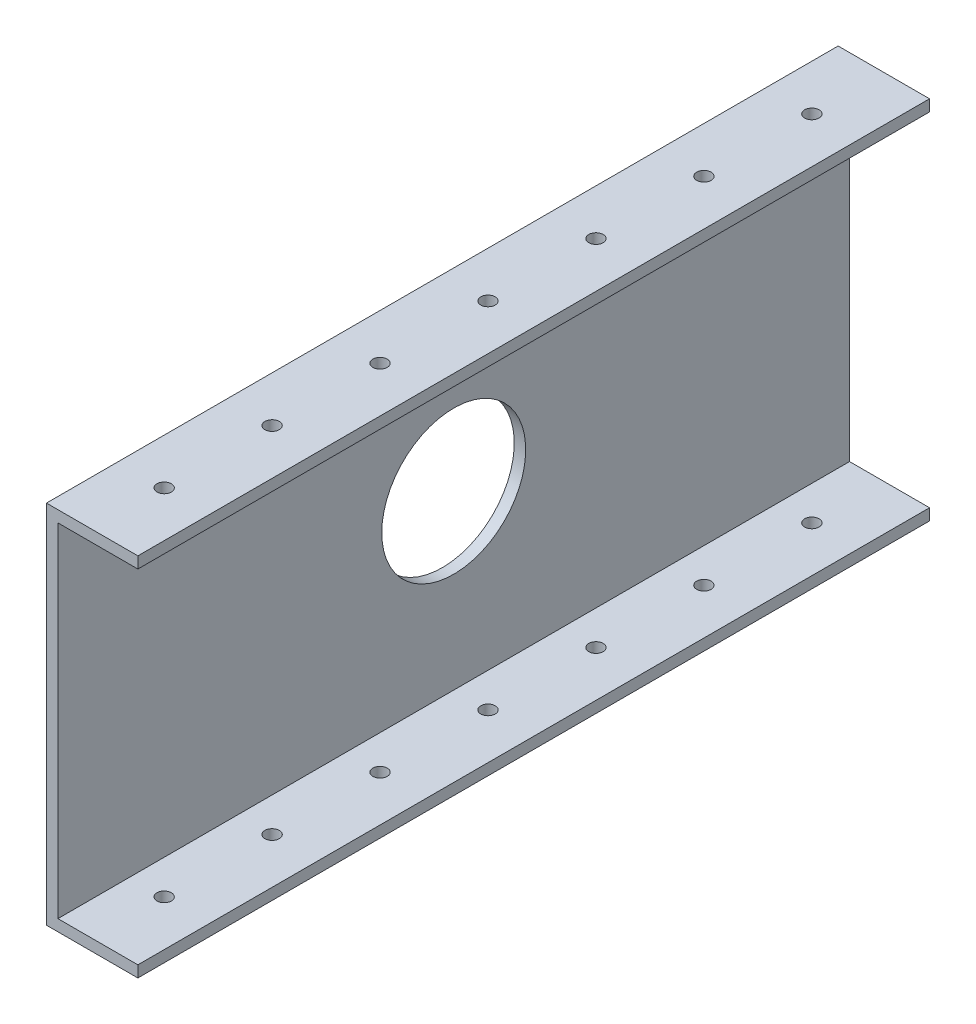
ISO-10303-21;
HEADER;
FILE_DESCRIPTION(('STEP AP214'),'2;1');
FILE_NAME('part.step','',(''),(''),'','','');
FILE_SCHEMA(('AUTOMOTIVE_DESIGN { 1 0 10303 214 1 1 1 1 }'));
ENDSEC;
DATA;
#1=APPLICATION_CONTEXT('core data for automotive mechanical design processes');
#2=APPLICATION_PROTOCOL_DEFINITION('international standard','automotive_design',2000,#1);
#3=PRODUCT_CONTEXT('',#1,'mechanical');
#4=PRODUCT('Part','Part','',(#3));
#5=PRODUCT_RELATED_PRODUCT_CATEGORY('part','',(#4));
#6=PRODUCT_DEFINITION_FORMATION('','',#4);
#7=PRODUCT_DEFINITION_CONTEXT('part definition',#1,'design');
#8=PRODUCT_DEFINITION('design','',#6,#7);
#9=PRODUCT_DEFINITION_SHAPE('','',#8);
#10=(LENGTH_UNIT() NAMED_UNIT(*) SI_UNIT(.MILLI.,.METRE.));
#11=(NAMED_UNIT(*) PLANE_ANGLE_UNIT() SI_UNIT($,.RADIAN.));
#12=(NAMED_UNIT(*) SI_UNIT($,.STERADIAN.) SOLID_ANGLE_UNIT());
#13=UNCERTAINTY_MEASURE_WITH_UNIT(LENGTH_MEASURE(1.E-05),#10,'distance_accuracy_value','');
#14=(GEOMETRIC_REPRESENTATION_CONTEXT(3) GLOBAL_UNCERTAINTY_ASSIGNED_CONTEXT((#13)) GLOBAL_UNIT_ASSIGNED_CONTEXT((#10,
#11,#12)) REPRESENTATION_CONTEXT('',''));
#15=CARTESIAN_POINT('',(0.,0.,0.));
#16=DIRECTION('',(0.,0.,1.));
#17=DIRECTION('',(1.,0.,0.));
#18=AXIS2_PLACEMENT_3D('',#15,#16,#17);
#19=CARTESIAN_POINT('',(0.,-51.0466019417476,220.));
#20=DIRECTION('',(0.,1.,0.));
#21=DIRECTION('',(0.,0.,1.));
#22=AXIS2_PLACEMENT_3D('',#19,#20,#21);
#23=PLANE('',#22);
#24=CARTESIAN_POINT('',(12.7000000000009,-51.0466019417476,200.));
#25=DIRECTION('',(0.,1.,0.));
#26=DIRECTION('',(0.,0.,1.));
#27=AXIS2_PLACEMENT_3D('',#24,#25,#26);
#28=CIRCLE('',#27,2.);
#29=CARTESIAN_POINT('',(12.7000000000009,-51.0466019417476,202.));
#30=VERTEX_POINT('',#29);
#31=EDGE_CURVE('E270',#30,#30,#28,.F.);
#32=ORIENTED_EDGE('',*,*,#31,.F.);
#33=EDGE_LOOP('',(#32));
#34=FACE_BOUND('',#33,.T.);
#35=CARTESIAN_POINT('',(12.7000000000006,-51.0466019417476,170.));
#36=DIRECTION('',(0.,1.,0.));
#37=DIRECTION('',(0.,0.,1.));
#38=AXIS2_PLACEMENT_3D('',#35,#36,#37);
#39=CIRCLE('',#38,2.);
#40=CARTESIAN_POINT('',(12.7000000000006,-51.0466019417476,172.));
#41=VERTEX_POINT('',#40);
#42=EDGE_CURVE('E280',#41,#41,#39,.F.);
#43=ORIENTED_EDGE('',*,*,#42,.F.);
#44=EDGE_LOOP('',(#43));
#45=FACE_BOUND('',#44,.T.);
#46=CARTESIAN_POINT('',(12.6999999999999,-51.0466019417476,80.));
#47=DIRECTION('',(0.,1.,0.));
#48=DIRECTION('',(0.,0.,1.));
#49=AXIS2_PLACEMENT_3D('',#46,#47,#48);
#50=CIRCLE('',#49,2.);
#51=CARTESIAN_POINT('',(12.6999999999999,-51.0466019417476,82.));
#52=VERTEX_POINT('',#51);
#53=EDGE_CURVE('E269',#52,#52,#50,.F.);
#54=ORIENTED_EDGE('',*,*,#53,.F.);
#55=EDGE_LOOP('',(#54));
#56=FACE_BOUND('',#55,.T.);
#57=CARTESIAN_POINT('',(12.6999999999998,-51.0466019417476,50.));
#58=DIRECTION('',(0.,1.,0.));
#59=DIRECTION('',(0.,0.,1.));
#60=AXIS2_PLACEMENT_3D('',#57,#58,#59);
#61=CIRCLE('',#60,2.);
#62=CARTESIAN_POINT('',(12.6999999999998,-51.0466019417476,52.));
#63=VERTEX_POINT('',#62);
#64=EDGE_CURVE('E288',#63,#63,#61,.F.);
#65=ORIENTED_EDGE('',*,*,#64,.F.);
#66=EDGE_LOOP('',(#65));
#67=FACE_BOUND('',#66,.T.);
#68=CARTESIAN_POINT('',(12.6999999999997,-51.0466019417476,20.));
#69=DIRECTION('',(0.,1.,0.));
#70=DIRECTION('',(0.,0.,1.));
#71=AXIS2_PLACEMENT_3D('',#68,#69,#70);
#72=CIRCLE('',#71,2.);
#73=CARTESIAN_POINT('',(12.6999999999997,-51.0466019417476,22.));
#74=VERTEX_POINT('',#73);
#75=EDGE_CURVE('E297',#74,#74,#72,.F.);
#76=ORIENTED_EDGE('',*,*,#75,.F.);
#77=EDGE_LOOP('',(#76));
#78=FACE_BOUND('',#77,.T.);
#79=CARTESIAN_POINT('',(12.7000000000003,-51.0466019417476,140.));
#80=DIRECTION('',(0.,1.,0.));
#81=DIRECTION('',(0.,0.,1.));
#82=AXIS2_PLACEMENT_3D('',#79,#80,#81);
#83=CIRCLE('',#82,2.);
#84=CARTESIAN_POINT('',(12.7000000000003,-51.0466019417476,142.));
#85=VERTEX_POINT('',#84);
#86=EDGE_CURVE('E304',#85,#85,#83,.F.);
#87=ORIENTED_EDGE('',*,*,#86,.F.);
#88=EDGE_LOOP('',(#87));
#89=FACE_BOUND('',#88,.T.);
#90=CARTESIAN_POINT('',(12.7,-51.0466019417476,110.));
#91=DIRECTION('',(0.,1.,0.));
#92=DIRECTION('',(0.,0.,1.));
#93=AXIS2_PLACEMENT_3D('',#90,#91,#92);
#94=CIRCLE('',#93,2.);
#95=CARTESIAN_POINT('',(12.7,-51.0466019417476,112.));
#96=VERTEX_POINT('',#95);
#97=EDGE_CURVE('E261',#96,#96,#94,.F.);
#98=ORIENTED_EDGE('',*,*,#97,.F.);
#99=EDGE_LOOP('',(#98));
#100=FACE_BOUND('',#99,.T.);
#101=DIRECTION('',(1.,0.,0.));
#102=VECTOR('',#101,1.);
#103=CARTESIAN_POINT('',(0.,-51.0466019417476,0.));
#104=LINE('',#103,#102);
#105=CARTESIAN_POINT('',(0.,-51.0466019417476,0.));
#106=VERTEX_POINT('',#105);
#107=CARTESIAN_POINT('',(25.4,-51.0466019417476,0.));
#108=VERTEX_POINT('',#107);
#109=EDGE_CURVE('E139',#106,#108,#104,.T.);
#110=ORIENTED_EDGE('',*,*,#109,.T.);
#111=DIRECTION('',(0.,0.,-1.));
#112=VECTOR('',#111,1.);
#113=CARTESIAN_POINT('',(25.4,-51.0466019417476,220.));
#114=LINE('',#113,#112);
#115=CARTESIAN_POINT('',(25.4,-51.0466019417476,220.));
#116=VERTEX_POINT('',#115);
#117=EDGE_CURVE('E11',#116,#108,#114,.T.);
#118=ORIENTED_EDGE('',*,*,#117,.F.);
#119=DIRECTION('',(1.,0.,0.));
#120=VECTOR('',#119,1.);
#121=CARTESIAN_POINT('',(0.,-51.0466019417476,220.));
#122=LINE('',#121,#120);
#123=CARTESIAN_POINT('',(0.,-51.0466019417476,220.));
#124=VERTEX_POINT('',#123);
#125=EDGE_CURVE('E162',#124,#116,#122,.T.);
#126=ORIENTED_EDGE('',*,*,#125,.F.);
#127=DIRECTION('',(0.,0.,-1.));
#128=VECTOR('',#127,1.);
#129=CARTESIAN_POINT('',(0.,-51.0466019417476,220.));
#130=LINE('',#129,#128);
#131=EDGE_CURVE('E135',#124,#106,#130,.T.);
#132=ORIENTED_EDGE('',*,*,#131,.T.);
#133=EDGE_LOOP('',(#110,#118,#126,#132));
#134=FACE_BOUND('',#133,.T.);
#135=ADVANCED_FACE('F38',(#34,#45,#56,#67,#78,#89,#100,#134),#23,.F.);
#136=CARTESIAN_POINT('',(25.4,-47.8716019417476,220.));
#137=DIRECTION('',(-1.,0.,0.));
#138=DIRECTION('',(0.,0.,1.));
#139=AXIS2_PLACEMENT_3D('',#136,#137,#138);
#140=PLANE('',#139);
#141=DIRECTION('',(0.,1.,0.));
#142=VECTOR('',#141,1.);
#143=CARTESIAN_POINT('',(25.4,-47.8716019417476,0.));
#144=LINE('',#143,#142);
#145=CARTESIAN_POINT('',(25.4,-47.8716019417476,0.));
#146=VERTEX_POINT('',#145);
#147=EDGE_CURVE('E143',#108,#146,#144,.T.);
#148=ORIENTED_EDGE('',*,*,#147,.T.);
#149=DIRECTION('',(0.,0.,-1.));
#150=VECTOR('',#149,1.);
#151=CARTESIAN_POINT('',(25.4,-47.8716019417476,220.));
#152=LINE('',#151,#150);
#153=CARTESIAN_POINT('',(25.4,-47.8716019417476,220.));
#154=VERTEX_POINT('',#153);
#155=EDGE_CURVE('E47',#154,#146,#152,.T.);
#156=ORIENTED_EDGE('',*,*,#155,.F.);
#157=DIRECTION('',(0.,1.,0.));
#158=VECTOR('',#157,1.);
#159=CARTESIAN_POINT('',(25.4,-47.8716019417476,220.));
#160=LINE('',#159,#158);
#161=EDGE_CURVE('E98',#116,#154,#160,.T.);
#162=ORIENTED_EDGE('',*,*,#161,.F.);
#163=ORIENTED_EDGE('',*,*,#117,.T.);
#164=EDGE_LOOP('',(#148,#156,#162,#163));
#165=FACE_BOUND('',#164,.T.);
#166=ADVANCED_FACE('F341',(#165),#140,.F.);
#167=CARTESIAN_POINT('',(3.175,-47.8716019417476,220.));
#168=DIRECTION('',(0.,-1.,0.));
#169=DIRECTION('',(0.,0.,-1.));
#170=AXIS2_PLACEMENT_3D('',#167,#168,#169);
#171=PLANE('',#170);
#172=CARTESIAN_POINT('',(12.7000000000009,-47.8716019417476,200.));
#173=DIRECTION('',(0.,-1.,0.));
#174=DIRECTION('',(0.,0.,-1.));
#175=AXIS2_PLACEMENT_3D('',#172,#173,#174);
#176=CIRCLE('',#175,2.);
#177=CARTESIAN_POINT('',(12.7000000000009,-47.8716019417476,198.));
#178=VERTEX_POINT('',#177);
#179=EDGE_CURVE('E144',#178,#178,#176,.T.);
#180=ORIENTED_EDGE('',*,*,#179,.T.);
#181=EDGE_LOOP('',(#180));
#182=FACE_BOUND('',#181,.T.);
#183=CARTESIAN_POINT('',(12.7000000000006,-47.8716019417476,170.));
#184=DIRECTION('',(0.,-1.,0.));
#185=DIRECTION('',(0.,0.,-1.));
#186=AXIS2_PLACEMENT_3D('',#183,#184,#185);
#187=CIRCLE('',#186,2.);
#188=CARTESIAN_POINT('',(12.7000000000006,-47.8716019417476,168.));
#189=VERTEX_POINT('',#188);
#190=EDGE_CURVE('E213',#189,#189,#187,.T.);
#191=ORIENTED_EDGE('',*,*,#190,.T.);
#192=EDGE_LOOP('',(#191));
#193=FACE_BOUND('',#192,.T.);
#194=CARTESIAN_POINT('',(12.6999999999999,-47.8716019417476,80.));
#195=DIRECTION('',(0.,-1.,0.));
#196=DIRECTION('',(0.,0.,-1.));
#197=AXIS2_PLACEMENT_3D('',#194,#195,#196);
#198=CIRCLE('',#197,2.);
#199=CARTESIAN_POINT('',(12.6999999999999,-47.8716019417476,78.));
#200=VERTEX_POINT('',#199);
#201=EDGE_CURVE('E221',#200,#200,#198,.T.);
#202=ORIENTED_EDGE('',*,*,#201,.T.);
#203=EDGE_LOOP('',(#202));
#204=FACE_BOUND('',#203,.T.);
#205=CARTESIAN_POINT('',(12.6999999999998,-47.8716019417476,50.));
#206=DIRECTION('',(0.,-1.,0.));
#207=DIRECTION('',(0.,0.,-1.));
#208=AXIS2_PLACEMENT_3D('',#205,#206,#207);
#209=CIRCLE('',#208,2.);
#210=CARTESIAN_POINT('',(12.6999999999998,-47.8716019417476,48.));
#211=VERTEX_POINT('',#210);
#212=EDGE_CURVE('E229',#211,#211,#209,.T.);
#213=ORIENTED_EDGE('',*,*,#212,.T.);
#214=EDGE_LOOP('',(#213));
#215=FACE_BOUND('',#214,.T.);
#216=CARTESIAN_POINT('',(12.6999999999997,-47.8716019417476,20.));
#217=DIRECTION('',(0.,-1.,0.));
#218=DIRECTION('',(0.,0.,-1.));
#219=AXIS2_PLACEMENT_3D('',#216,#217,#218);
#220=CIRCLE('',#219,2.);
#221=CARTESIAN_POINT('',(12.6999999999997,-47.8716019417476,18.));
#222=VERTEX_POINT('',#221);
#223=EDGE_CURVE('E237',#222,#222,#220,.T.);
#224=ORIENTED_EDGE('',*,*,#223,.T.);
#225=EDGE_LOOP('',(#224));
#226=FACE_BOUND('',#225,.T.);
#227=CARTESIAN_POINT('',(12.7000000000003,-47.8716019417476,140.));
#228=DIRECTION('',(0.,-1.,0.));
#229=DIRECTION('',(0.,0.,-1.));
#230=AXIS2_PLACEMENT_3D('',#227,#228,#229);
#231=CIRCLE('',#230,2.);
#232=CARTESIAN_POINT('',(12.7000000000003,-47.8716019417476,138.));
#233=VERTEX_POINT('',#232);
#234=EDGE_CURVE('E245',#233,#233,#231,.T.);
#235=ORIENTED_EDGE('',*,*,#234,.T.);
#236=EDGE_LOOP('',(#235));
#237=FACE_BOUND('',#236,.T.);
#238=CARTESIAN_POINT('',(12.7,-47.8716019417476,110.));
#239=DIRECTION('',(0.,-1.,0.));
#240=DIRECTION('',(0.,0.,-1.));
#241=AXIS2_PLACEMENT_3D('',#238,#239,#240);
#242=CIRCLE('',#241,2.);
#243=CARTESIAN_POINT('',(12.7,-47.8716019417476,108.));
#244=VERTEX_POINT('',#243);
#245=EDGE_CURVE('E253',#244,#244,#242,.T.);
#246=ORIENTED_EDGE('',*,*,#245,.T.);
#247=EDGE_LOOP('',(#246));
#248=FACE_BOUND('',#247,.T.);
#249=DIRECTION('',(-1.,0.,0.));
#250=VECTOR('',#249,1.);
#251=CARTESIAN_POINT('',(3.175,-47.8716019417476,0.));
#252=LINE('',#251,#250);
#253=CARTESIAN_POINT('',(3.175,-47.8716019417476,0.));
#254=VERTEX_POINT('',#253);
#255=EDGE_CURVE('E147',#146,#254,#252,.T.);
#256=ORIENTED_EDGE('',*,*,#255,.T.);
#257=DIRECTION('',(0.,0.,-1.));
#258=VECTOR('',#257,1.);
#259=CARTESIAN_POINT('',(3.175,-47.8716019417476,220.));
#260=LINE('',#259,#258);
#261=CARTESIAN_POINT('',(3.175,-47.8716019417476,220.));
#262=VERTEX_POINT('',#261);
#263=EDGE_CURVE('E173',#262,#254,#260,.T.);
#264=ORIENTED_EDGE('',*,*,#263,.F.);
#265=DIRECTION('',(-1.,0.,0.));
#266=VECTOR('',#265,1.);
#267=CARTESIAN_POINT('',(3.175,-47.8716019417476,220.));
#268=LINE('',#267,#266);
#269=EDGE_CURVE('E183',#154,#262,#268,.T.);
#270=ORIENTED_EDGE('',*,*,#269,.F.);
#271=ORIENTED_EDGE('',*,*,#155,.T.);
#272=EDGE_LOOP('',(#256,#264,#270,#271));
#273=FACE_BOUND('',#272,.T.);
#274=ADVANCED_FACE('F181',(#182,#193,#204,#215,#226,#237,#248,#273),#171,.F.);
#275=CARTESIAN_POINT('',(3.175,-47.8716019417476,220.));
#276=DIRECTION('',(-1.,0.,0.));
#277=DIRECTION('',(0.,0.,1.));
#278=AXIS2_PLACEMENT_3D('',#275,#276,#277);
#279=PLANE('',#278);
#280=CARTESIAN_POINT('',(3.17500000000001,0.,110.));
#281=DIRECTION('',(-1.,0.,0.));
#282=DIRECTION('',(0.,0.,1.));
#283=AXIS2_PLACEMENT_3D('',#280,#281,#282);
#284=CIRCLE('',#283,20.);
#285=CARTESIAN_POINT('',(3.17500000000001,0.,130.));
#286=VERTEX_POINT('',#285);
#287=EDGE_CURVE('E279',#286,#286,#284,.T.);
#288=ORIENTED_EDGE('',*,*,#287,.T.);
#289=EDGE_LOOP('',(#288));
#290=FACE_BOUND('',#289,.T.);
#291=DIRECTION('',(0.,1.,0.));
#292=VECTOR('',#291,1.);
#293=CARTESIAN_POINT('',(3.175,-47.8716019417476,0.));
#294=LINE('',#293,#292);
#295=CARTESIAN_POINT('',(3.175,47.3783980582524,0.));
#296=VERTEX_POINT('',#295);
#297=EDGE_CURVE('E150',#254,#296,#294,.T.);
#298=ORIENTED_EDGE('',*,*,#297,.T.);
#299=DIRECTION('',(0.,0.,-1.));
#300=VECTOR('',#299,1.);
#301=CARTESIAN_POINT('',(3.175,47.3783980582524,220.));
#302=LINE('',#301,#300);
#303=CARTESIAN_POINT('',(3.175,47.3783980582524,220.));
#304=VERTEX_POINT('',#303);
#305=EDGE_CURVE('E169',#304,#296,#302,.T.);
#306=ORIENTED_EDGE('',*,*,#305,.F.);
#307=DIRECTION('',(0.,1.,0.));
#308=VECTOR('',#307,1.);
#309=CARTESIAN_POINT('',(3.175,-47.8716019417476,220.));
#310=LINE('',#309,#308);
#311=EDGE_CURVE('E196',#262,#304,#310,.T.);
#312=ORIENTED_EDGE('',*,*,#311,.F.);
#313=ORIENTED_EDGE('',*,*,#263,.T.);
#314=EDGE_LOOP('',(#298,#306,#312,#313));
#315=FACE_BOUND('',#314,.T.);
#316=ADVANCED_FACE('F191',(#290,#315),#279,.F.);
#317=CARTESIAN_POINT('',(3.175,47.3783980582524,220.));
#318=DIRECTION('',(0.,1.,0.));
#319=DIRECTION('',(0.,0.,1.));
#320=AXIS2_PLACEMENT_3D('',#317,#318,#319);
#321=PLANE('',#320);
#322=CARTESIAN_POINT('',(12.7000000000009,47.3783980582524,200.));
#323=DIRECTION('',(0.,1.,0.));
#324=DIRECTION('',(0.,0.,1.));
#325=AXIS2_PLACEMENT_3D('',#322,#323,#324);
#326=CIRCLE('',#325,2.);
#327=CARTESIAN_POINT('',(12.7000000000009,47.3783980582524,202.));
#328=VERTEX_POINT('',#327);
#329=EDGE_CURVE('E209',#328,#328,#326,.T.);
#330=ORIENTED_EDGE('',*,*,#329,.T.);
#331=EDGE_LOOP('',(#330));
#332=FACE_BOUND('',#331,.T.);
#333=CARTESIAN_POINT('',(12.7000000000006,47.3783980582524,170.));
#334=DIRECTION('',(0.,1.,0.));
#335=DIRECTION('',(0.,0.,1.));
#336=AXIS2_PLACEMENT_3D('',#333,#334,#335);
#337=CIRCLE('',#336,2.);
#338=CARTESIAN_POINT('',(12.7000000000006,47.3783980582524,172.));
#339=VERTEX_POINT('',#338);
#340=EDGE_CURVE('E217',#339,#339,#337,.T.);
#341=ORIENTED_EDGE('',*,*,#340,.T.);
#342=EDGE_LOOP('',(#341));
#343=FACE_BOUND('',#342,.T.);
#344=CARTESIAN_POINT('',(12.6999999999999,47.3783980582524,80.));
#345=DIRECTION('',(0.,1.,0.));
#346=DIRECTION('',(0.,0.,1.));
#347=AXIS2_PLACEMENT_3D('',#344,#345,#346);
#348=CIRCLE('',#347,2.);
#349=CARTESIAN_POINT('',(12.6999999999999,47.3783980582524,82.));
#350=VERTEX_POINT('',#349);
#351=EDGE_CURVE('E225',#350,#350,#348,.T.);
#352=ORIENTED_EDGE('',*,*,#351,.T.);
#353=EDGE_LOOP('',(#352));
#354=FACE_BOUND('',#353,.T.);
#355=CARTESIAN_POINT('',(12.6999999999998,47.3783980582524,50.));
#356=DIRECTION('',(0.,1.,0.));
#357=DIRECTION('',(0.,0.,1.));
#358=AXIS2_PLACEMENT_3D('',#355,#356,#357);
#359=CIRCLE('',#358,2.);
#360=CARTESIAN_POINT('',(12.6999999999998,47.3783980582524,52.));
#361=VERTEX_POINT('',#360);
#362=EDGE_CURVE('E233',#361,#361,#359,.T.);
#363=ORIENTED_EDGE('',*,*,#362,.T.);
#364=EDGE_LOOP('',(#363));
#365=FACE_BOUND('',#364,.T.);
#366=CARTESIAN_POINT('',(12.6999999999997,47.3783980582524,20.));
#367=DIRECTION('',(0.,1.,0.));
#368=DIRECTION('',(0.,0.,1.));
#369=AXIS2_PLACEMENT_3D('',#366,#367,#368);
#370=CIRCLE('',#369,2.);
#371=CARTESIAN_POINT('',(12.6999999999997,47.3783980582524,22.));
#372=VERTEX_POINT('',#371);
#373=EDGE_CURVE('E241',#372,#372,#370,.T.);
#374=ORIENTED_EDGE('',*,*,#373,.T.);
#375=EDGE_LOOP('',(#374));
#376=FACE_BOUND('',#375,.T.);
#377=CARTESIAN_POINT('',(12.7000000000003,47.3783980582524,140.));
#378=DIRECTION('',(0.,1.,0.));
#379=DIRECTION('',(0.,0.,1.));
#380=AXIS2_PLACEMENT_3D('',#377,#378,#379);
#381=CIRCLE('',#380,2.);
#382=CARTESIAN_POINT('',(12.7000000000003,47.3783980582524,142.));
#383=VERTEX_POINT('',#382);
#384=EDGE_CURVE('E249',#383,#383,#381,.T.);
#385=ORIENTED_EDGE('',*,*,#384,.T.);
#386=EDGE_LOOP('',(#385));
#387=FACE_BOUND('',#386,.T.);
#388=CARTESIAN_POINT('',(12.7,47.3783980582524,110.));
#389=DIRECTION('',(0.,1.,0.));
#390=DIRECTION('',(0.,0.,1.));
#391=AXIS2_PLACEMENT_3D('',#388,#389,#390);
#392=CIRCLE('',#391,2.);
#393=CARTESIAN_POINT('',(12.7,47.3783980582524,112.));
#394=VERTEX_POINT('',#393);
#395=EDGE_CURVE('E257',#394,#394,#392,.T.);
#396=ORIENTED_EDGE('',*,*,#395,.T.);
#397=EDGE_LOOP('',(#396));
#398=FACE_BOUND('',#397,.T.);
#399=DIRECTION('',(1.,0.,0.));
#400=VECTOR('',#399,1.);
#401=CARTESIAN_POINT('',(3.175,47.3783980582524,0.));
#402=LINE('',#401,#400);
#403=CARTESIAN_POINT('',(25.4,47.3783980582524,0.));
#404=VERTEX_POINT('',#403);
#405=EDGE_CURVE('E153',#296,#404,#402,.T.);
#406=ORIENTED_EDGE('',*,*,#405,.T.);
#407=DIRECTION('',(0.,0.,-1.));
#408=VECTOR('',#407,1.);
#409=CARTESIAN_POINT('',(25.4,47.3783980582524,220.));
#410=LINE('',#409,#408);
#411=CARTESIAN_POINT('',(25.4,47.3783980582524,220.));
#412=VERTEX_POINT('',#411);
#413=EDGE_CURVE('E128',#412,#404,#410,.T.);
#414=ORIENTED_EDGE('',*,*,#413,.F.);
#415=DIRECTION('',(1.,0.,0.));
#416=VECTOR('',#415,1.);
#417=CARTESIAN_POINT('',(3.175,47.3783980582524,220.));
#418=LINE('',#417,#416);
#419=EDGE_CURVE('E117',#304,#412,#418,.T.);
#420=ORIENTED_EDGE('',*,*,#419,.F.);
#421=ORIENTED_EDGE('',*,*,#305,.T.);
#422=EDGE_LOOP('',(#406,#414,#420,#421));
#423=FACE_BOUND('',#422,.T.);
#424=ADVANCED_FACE('F194',(#332,#343,#354,#365,#376,#387,#398,#423),#321,.F.);
#425=CARTESIAN_POINT('',(25.4,50.5533980582524,220.));
#426=DIRECTION('',(-1.,0.,0.));
#427=DIRECTION('',(0.,0.,1.));
#428=AXIS2_PLACEMENT_3D('',#425,#426,#427);
#429=PLANE('',#428);
#430=DIRECTION('',(0.,1.,0.));
#431=VECTOR('',#430,1.);
#432=CARTESIAN_POINT('',(25.4,50.5533980582524,0.));
#433=LINE('',#432,#431);
#434=CARTESIAN_POINT('',(25.4,50.5533980582524,0.));
#435=VERTEX_POINT('',#434);
#436=EDGE_CURVE('E126',#404,#435,#433,.T.);
#437=ORIENTED_EDGE('',*,*,#436,.T.);
#438=DIRECTION('',(0.,0.,-1.));
#439=VECTOR('',#438,1.);
#440=CARTESIAN_POINT('',(25.4,50.5533980582524,220.));
#441=LINE('',#440,#439);
#442=CARTESIAN_POINT('',(25.4,50.5533980582524,220.));
#443=VERTEX_POINT('',#442);
#444=EDGE_CURVE('E123',#443,#435,#441,.T.);
#445=ORIENTED_EDGE('',*,*,#444,.F.);
#446=DIRECTION('',(0.,1.,0.));
#447=VECTOR('',#446,1.);
#448=CARTESIAN_POINT('',(25.4,50.5533980582524,220.));
#449=LINE('',#448,#447);
#450=EDGE_CURVE('E111',#412,#443,#449,.T.);
#451=ORIENTED_EDGE('',*,*,#450,.F.);
#452=ORIENTED_EDGE('',*,*,#413,.T.);
#453=EDGE_LOOP('',(#437,#445,#451,#452));
#454=FACE_BOUND('',#453,.T.);
#455=ADVANCED_FACE('F124',(#454),#429,.F.);
#456=CARTESIAN_POINT('',(0.,50.5533980582524,220.));
#457=DIRECTION('',(0.,-1.,0.));
#458=DIRECTION('',(0.,0.,-1.));
#459=AXIS2_PLACEMENT_3D('',#456,#457,#458);
#460=PLANE('',#459);
#461=CARTESIAN_POINT('',(12.7000000000009,50.5533980582524,200.));
#462=DIRECTION('',(0.,1.,0.));
#463=DIRECTION('',(0.,0.,1.));
#464=AXIS2_PLACEMENT_3D('',#461,#462,#463);
#465=CIRCLE('',#464,2.);
#466=CARTESIAN_POINT('',(12.7000000000009,50.5533980582524,202.));
#467=VERTEX_POINT('',#466);
#468=EDGE_CURVE('E275',#467,#467,#465,.T.);
#469=ORIENTED_EDGE('',*,*,#468,.F.);
#470=EDGE_LOOP('',(#469));
#471=FACE_BOUND('',#470,.T.);
#472=CARTESIAN_POINT('',(12.7000000000006,50.5533980582524,170.));
#473=DIRECTION('',(0.,1.,0.));
#474=DIRECTION('',(0.,0.,1.));
#475=AXIS2_PLACEMENT_3D('',#472,#473,#474);
#476=CIRCLE('',#475,2.);
#477=CARTESIAN_POINT('',(12.7000000000006,50.5533980582524,172.));
#478=VERTEX_POINT('',#477);
#479=EDGE_CURVE('E274',#478,#478,#476,.T.);
#480=ORIENTED_EDGE('',*,*,#479,.F.);
#481=EDGE_LOOP('',(#480));
#482=FACE_BOUND('',#481,.T.);
#483=CARTESIAN_POINT('',(12.6999999999999,50.5533980582524,80.));
#484=DIRECTION('',(0.,1.,0.));
#485=DIRECTION('',(0.,0.,1.));
#486=AXIS2_PLACEMENT_3D('',#483,#484,#485);
#487=CIRCLE('',#486,2.);
#488=CARTESIAN_POINT('',(12.6999999999999,50.5533980582524,82.));
#489=VERTEX_POINT('',#488);
#490=EDGE_CURVE('E292',#489,#489,#487,.T.);
#491=ORIENTED_EDGE('',*,*,#490,.F.);
#492=EDGE_LOOP('',(#491));
#493=FACE_BOUND('',#492,.T.);
#494=CARTESIAN_POINT('',(12.6999999999998,50.5533980582524,50.));
#495=DIRECTION('',(0.,1.,0.));
#496=DIRECTION('',(0.,0.,1.));
#497=AXIS2_PLACEMENT_3D('',#494,#495,#496);
#498=CIRCLE('',#497,2.);
#499=CARTESIAN_POINT('',(12.6999999999998,50.5533980582524,52.));
#500=VERTEX_POINT('',#499);
#501=EDGE_CURVE('E293',#500,#500,#498,.T.);
#502=ORIENTED_EDGE('',*,*,#501,.F.);
#503=EDGE_LOOP('',(#502));
#504=FACE_BOUND('',#503,.T.);
#505=CARTESIAN_POINT('',(12.6999999999997,50.5533980582524,20.));
#506=DIRECTION('',(0.,1.,0.));
#507=DIRECTION('',(0.,0.,1.));
#508=AXIS2_PLACEMENT_3D('',#505,#506,#507);
#509=CIRCLE('',#508,2.);
#510=CARTESIAN_POINT('',(12.6999999999997,50.5533980582524,22.));
#511=VERTEX_POINT('',#510);
#512=EDGE_CURVE('E308',#511,#511,#509,.T.);
#513=ORIENTED_EDGE('',*,*,#512,.F.);
#514=EDGE_LOOP('',(#513));
#515=FACE_BOUND('',#514,.T.);
#516=CARTESIAN_POINT('',(12.7000000000003,50.5533980582524,140.));
#517=DIRECTION('',(0.,1.,0.));
#518=DIRECTION('',(0.,0.,1.));
#519=AXIS2_PLACEMENT_3D('',#516,#517,#518);
#520=CIRCLE('',#519,2.);
#521=CARTESIAN_POINT('',(12.7000000000003,50.5533980582524,142.));
#522=VERTEX_POINT('',#521);
#523=EDGE_CURVE('E284',#522,#522,#520,.T.);
#524=ORIENTED_EDGE('',*,*,#523,.F.);
#525=EDGE_LOOP('',(#524));
#526=FACE_BOUND('',#525,.T.);
#527=CARTESIAN_POINT('',(12.7,50.5533980582524,110.));
#528=DIRECTION('',(0.,1.,0.));
#529=DIRECTION('',(0.,0.,1.));
#530=AXIS2_PLACEMENT_3D('',#527,#528,#529);
#531=CIRCLE('',#530,2.);
#532=CARTESIAN_POINT('',(12.7,50.5533980582524,112.));
#533=VERTEX_POINT('',#532);
#534=EDGE_CURVE('E265',#533,#533,#531,.T.);
#535=ORIENTED_EDGE('',*,*,#534,.F.);
#536=EDGE_LOOP('',(#535));
#537=FACE_BOUND('',#536,.T.);
#538=DIRECTION('',(-1.,0.,0.));
#539=VECTOR('',#538,1.);
#540=CARTESIAN_POINT('',(0.,50.5533980582524,0.));
#541=LINE('',#540,#539);
#542=CARTESIAN_POINT('',(0.,50.5533980582524,0.));
#543=VERTEX_POINT('',#542);
#544=EDGE_CURVE('E84',#435,#543,#541,.T.);
#545=ORIENTED_EDGE('',*,*,#544,.T.);
#546=DIRECTION('',(0.,0.,-1.));
#547=VECTOR('',#546,1.);
#548=CARTESIAN_POINT('',(0.,50.5533980582524,220.));
#549=LINE('',#548,#547);
#550=CARTESIAN_POINT('',(0.,50.5533980582524,220.));
#551=VERTEX_POINT('',#550);
#552=EDGE_CURVE('E129',#551,#543,#549,.T.);
#553=ORIENTED_EDGE('',*,*,#552,.F.);
#554=DIRECTION('',(-1.,0.,0.));
#555=VECTOR('',#554,1.);
#556=CARTESIAN_POINT('',(0.,50.5533980582524,220.));
#557=LINE('',#556,#555);
#558=EDGE_CURVE('E115',#443,#551,#557,.T.);
#559=ORIENTED_EDGE('',*,*,#558,.F.);
#560=ORIENTED_EDGE('',*,*,#444,.T.);
#561=EDGE_LOOP('',(#545,#553,#559,#560));
#562=FACE_BOUND('',#561,.T.);
#563=ADVANCED_FACE('F131',(#471,#482,#493,#504,#515,#526,#537,#562),#460,.F.);
#564=CARTESIAN_POINT('',(0.,-51.0466019417476,220.));
#565=DIRECTION('',(1.,0.,0.));
#566=DIRECTION('',(0.,0.,-1.));
#567=AXIS2_PLACEMENT_3D('',#564,#565,#566);
#568=PLANE('',#567);
#569=CARTESIAN_POINT('',(0.,0.,110.));
#570=DIRECTION('',(-1.,0.,0.));
#571=DIRECTION('',(0.,0.,1.));
#572=AXIS2_PLACEMENT_3D('',#569,#570,#571);
#573=CIRCLE('',#572,20.);
#574=CARTESIAN_POINT('',(0.,0.,130.));
#575=VERTEX_POINT('',#574);
#576=EDGE_CURVE('E321',#575,#575,#573,.T.);
#577=ORIENTED_EDGE('',*,*,#576,.F.);
#578=EDGE_LOOP('',(#577));
#579=FACE_BOUND('',#578,.T.);
#580=DIRECTION('',(0.,-1.,0.));
#581=VECTOR('',#580,1.);
#582=CARTESIAN_POINT('',(0.,-51.0466019417476,0.));
#583=LINE('',#582,#581);
#584=EDGE_CURVE('E90',#543,#106,#583,.T.);
#585=ORIENTED_EDGE('',*,*,#584,.T.);
#586=ORIENTED_EDGE('',*,*,#131,.F.);
#587=DIRECTION('',(0.,-1.,0.));
#588=VECTOR('',#587,1.);
#589=CARTESIAN_POINT('',(0.,-51.0466019417476,220.));
#590=LINE('',#589,#588);
#591=EDGE_CURVE('E55',#551,#124,#590,.T.);
#592=ORIENTED_EDGE('',*,*,#591,.F.);
#593=ORIENTED_EDGE('',*,*,#552,.T.);
#594=EDGE_LOOP('',(#585,#586,#592,#593));
#595=FACE_BOUND('',#594,.T.);
#596=ADVANCED_FACE('F329',(#579,#595),#568,.F.);
#597=CARTESIAN_POINT('',(0.,0.,220.));
#598=DIRECTION('',(0.,0.,-1.));
#599=DIRECTION('',(-1.,0.,0.));
#600=AXIS2_PLACEMENT_3D('',#597,#598,#599);
#601=PLANE('',#600);
#602=ORIENTED_EDGE('',*,*,#125,.T.);
#603=ORIENTED_EDGE('',*,*,#161,.T.);
#604=ORIENTED_EDGE('',*,*,#269,.T.);
#605=ORIENTED_EDGE('',*,*,#311,.T.);
#606=ORIENTED_EDGE('',*,*,#419,.T.);
#607=ORIENTED_EDGE('',*,*,#450,.T.);
#608=ORIENTED_EDGE('',*,*,#558,.T.);
#609=ORIENTED_EDGE('',*,*,#591,.T.);
#610=EDGE_LOOP('',(#602,#603,#604,#605,#606,#607,#608,#609));
#611=FACE_BOUND('',#610,.T.);
#612=ADVANCED_FACE('F113',(#611),#601,.F.);
#613=CARTESIAN_POINT('',(0.,0.,0.));
#614=DIRECTION('',(0.,0.,-1.));
#615=DIRECTION('',(-1.,0.,0.));
#616=AXIS2_PLACEMENT_3D('',#613,#614,#615);
#617=PLANE('',#616);
#618=ORIENTED_EDGE('',*,*,#109,.F.);
#619=ORIENTED_EDGE('',*,*,#584,.F.);
#620=ORIENTED_EDGE('',*,*,#544,.F.);
#621=ORIENTED_EDGE('',*,*,#436,.F.);
#622=ORIENTED_EDGE('',*,*,#405,.F.);
#623=ORIENTED_EDGE('',*,*,#297,.F.);
#624=ORIENTED_EDGE('',*,*,#255,.F.);
#625=ORIENTED_EDGE('',*,*,#147,.F.);
#626=EDGE_LOOP('',(#618,#619,#620,#621,#622,#623,#624,#625));
#627=FACE_BOUND('',#626,.T.);
#628=ADVANCED_FACE('F187',(#627),#617,.T.);
#629=CARTESIAN_POINT('',(12.7,-56.70345619124,110.));
#630=DIRECTION('',(0.,1.,0.));
#631=DIRECTION('',(0.,0.,1.));
#632=AXIS2_PLACEMENT_3D('',#629,#630,#631);
#633=CYLINDRICAL_SURFACE('',#632,2.);
#634=ORIENTED_EDGE('',*,*,#534,.T.);
#635=EDGE_LOOP('',(#634));
#636=FACE_BOUND('',#635,.T.);
#637=ORIENTED_EDGE('',*,*,#395,.F.);
#638=EDGE_LOOP('',(#637));
#639=FACE_BOUND('',#638,.T.);
#640=ADVANCED_FACE('F369',(#636,#639),#633,.F.);
#641=CARTESIAN_POINT('',(12.7000000000003,-56.70345619124,140.));
#642=DIRECTION('',(0.,1.,0.));
#643=DIRECTION('',(0.,0.,1.));
#644=AXIS2_PLACEMENT_3D('',#641,#642,#643);
#645=CYLINDRICAL_SURFACE('',#644,2.);
#646=ORIENTED_EDGE('',*,*,#523,.T.);
#647=EDGE_LOOP('',(#646));
#648=FACE_BOUND('',#647,.T.);
#649=ORIENTED_EDGE('',*,*,#384,.F.);
#650=EDGE_LOOP('',(#649));
#651=FACE_BOUND('',#650,.T.);
#652=ADVANCED_FACE('F408',(#648,#651),#645,.F.);
#653=CARTESIAN_POINT('',(12.6999999999997,-56.70345619124,20.));
#654=DIRECTION('',(0.,1.,0.));
#655=DIRECTION('',(0.,0.,1.));
#656=AXIS2_PLACEMENT_3D('',#653,#654,#655);
#657=CYLINDRICAL_SURFACE('',#656,2.);
#658=ORIENTED_EDGE('',*,*,#512,.T.);
#659=EDGE_LOOP('',(#658));
#660=FACE_BOUND('',#659,.T.);
#661=ORIENTED_EDGE('',*,*,#373,.F.);
#662=EDGE_LOOP('',(#661));
#663=FACE_BOUND('',#662,.T.);
#664=ADVANCED_FACE('F419',(#660,#663),#657,.F.);
#665=CARTESIAN_POINT('',(12.6999999999998,-56.70345619124,50.));
#666=DIRECTION('',(0.,1.,0.));
#667=DIRECTION('',(0.,0.,1.));
#668=AXIS2_PLACEMENT_3D('',#665,#666,#667);
#669=CYLINDRICAL_SURFACE('',#668,2.);
#670=ORIENTED_EDGE('',*,*,#501,.T.);
#671=EDGE_LOOP('',(#670));
#672=FACE_BOUND('',#671,.T.);
#673=ORIENTED_EDGE('',*,*,#362,.F.);
#674=EDGE_LOOP('',(#673));
#675=FACE_BOUND('',#674,.T.);
#676=ADVANCED_FACE('F429',(#672,#675),#669,.F.);
#677=CARTESIAN_POINT('',(12.6999999999999,-56.70345619124,80.));
#678=DIRECTION('',(0.,1.,0.));
#679=DIRECTION('',(0.,0.,1.));
#680=AXIS2_PLACEMENT_3D('',#677,#678,#679);
#681=CYLINDRICAL_SURFACE('',#680,2.);
#682=ORIENTED_EDGE('',*,*,#490,.T.);
#683=EDGE_LOOP('',(#682));
#684=FACE_BOUND('',#683,.T.);
#685=ORIENTED_EDGE('',*,*,#351,.F.);
#686=EDGE_LOOP('',(#685));
#687=FACE_BOUND('',#686,.T.);
#688=ADVANCED_FACE('F440',(#684,#687),#681,.F.);
#689=CARTESIAN_POINT('',(12.7000000000006,-56.70345619124,170.));
#690=DIRECTION('',(0.,1.,0.));
#691=DIRECTION('',(0.,0.,1.));
#692=AXIS2_PLACEMENT_3D('',#689,#690,#691);
#693=CYLINDRICAL_SURFACE('',#692,2.);
#694=ORIENTED_EDGE('',*,*,#479,.T.);
#695=EDGE_LOOP('',(#694));
#696=FACE_BOUND('',#695,.T.);
#697=ORIENTED_EDGE('',*,*,#340,.F.);
#698=EDGE_LOOP('',(#697));
#699=FACE_BOUND('',#698,.T.);
#700=ADVANCED_FACE('F451',(#696,#699),#693,.F.);
#701=CARTESIAN_POINT('',(12.7000000000009,-56.70345619124,200.));
#702=DIRECTION('',(0.,1.,0.));
#703=DIRECTION('',(0.,0.,1.));
#704=AXIS2_PLACEMENT_3D('',#701,#702,#703);
#705=CYLINDRICAL_SURFACE('',#704,2.);
#706=ORIENTED_EDGE('',*,*,#468,.T.);
#707=EDGE_LOOP('',(#706));
#708=FACE_BOUND('',#707,.T.);
#709=ORIENTED_EDGE('',*,*,#329,.F.);
#710=EDGE_LOOP('',(#709));
#711=FACE_BOUND('',#710,.T.);
#712=ADVANCED_FACE('F367',(#708,#711),#705,.F.);
#713=ORIENTED_EDGE('',*,*,#97,.T.);
#714=EDGE_LOOP('',(#713));
#715=FACE_BOUND('',#714,.T.);
#716=ORIENTED_EDGE('',*,*,#245,.F.);
#717=EDGE_LOOP('',(#716));
#718=FACE_BOUND('',#717,.T.);
#719=ADVANCED_FACE('F363',(#715,#718),#633,.F.);
#720=ORIENTED_EDGE('',*,*,#86,.T.);
#721=EDGE_LOOP('',(#720));
#722=FACE_BOUND('',#721,.T.);
#723=ORIENTED_EDGE('',*,*,#234,.F.);
#724=EDGE_LOOP('',(#723));
#725=FACE_BOUND('',#724,.T.);
#726=ADVANCED_FACE('F366',(#722,#725),#645,.F.);
#727=ORIENTED_EDGE('',*,*,#75,.T.);
#728=EDGE_LOOP('',(#727));
#729=FACE_BOUND('',#728,.T.);
#730=ORIENTED_EDGE('',*,*,#223,.F.);
#731=EDGE_LOOP('',(#730));
#732=FACE_BOUND('',#731,.T.);
#733=ADVANCED_FACE('F432',(#729,#732),#657,.F.);
#734=ORIENTED_EDGE('',*,*,#64,.T.);
#735=EDGE_LOOP('',(#734));
#736=FACE_BOUND('',#735,.T.);
#737=ORIENTED_EDGE('',*,*,#212,.F.);
#738=EDGE_LOOP('',(#737));
#739=FACE_BOUND('',#738,.T.);
#740=ADVANCED_FACE('F443',(#736,#739),#669,.F.);
#741=ORIENTED_EDGE('',*,*,#53,.T.);
#742=EDGE_LOOP('',(#741));
#743=FACE_BOUND('',#742,.T.);
#744=ORIENTED_EDGE('',*,*,#201,.F.);
#745=EDGE_LOOP('',(#744));
#746=FACE_BOUND('',#745,.T.);
#747=ADVANCED_FACE('F454',(#743,#746),#681,.F.);
#748=ORIENTED_EDGE('',*,*,#42,.T.);
#749=EDGE_LOOP('',(#748));
#750=FACE_BOUND('',#749,.T.);
#751=ORIENTED_EDGE('',*,*,#190,.F.);
#752=EDGE_LOOP('',(#751));
#753=FACE_BOUND('',#752,.T.);
#754=ADVANCED_FACE('F464',(#750,#753),#693,.F.);
#755=ORIENTED_EDGE('',*,*,#31,.T.);
#756=EDGE_LOOP('',(#755));
#757=FACE_BOUND('',#756,.T.);
#758=ORIENTED_EDGE('',*,*,#179,.F.);
#759=EDGE_LOOP('',(#758));
#760=FACE_BOUND('',#759,.T.);
#761=ADVANCED_FACE('F474',(#757,#760),#705,.F.);
#762=CARTESIAN_POINT('',(220.,0.,110.));
#763=DIRECTION('',(-1.,0.,0.));
#764=DIRECTION('',(0.,0.,1.));
#765=AXIS2_PLACEMENT_3D('',#762,#763,#764);
#766=CYLINDRICAL_SURFACE('',#765,20.);
#767=ORIENTED_EDGE('',*,*,#576,.T.);
#768=EDGE_LOOP('',(#767));
#769=FACE_BOUND('',#768,.T.);
#770=ORIENTED_EDGE('',*,*,#287,.F.);
#771=EDGE_LOOP('',(#770));
#772=FACE_BOUND('',#771,.T.);
#773=ADVANCED_FACE('F326',(#769,#772),#766,.F.);
#774=CLOSED_SHELL('',(#135,#166,#274,#316,#424,#455,#563,#596,#612,#628,#640,#652,#664,#676,
#688,#700,#712,#719,#726,#733,#740,#747,#754,#761,#773));
#775=MANIFOLD_SOLID_BREP('B2',#774);
#776=ADVANCED_BREP_SHAPE_REPRESENTATION('',(#18,#775),#14);
#777=SHAPE_DEFINITION_REPRESENTATION(#9,#776);
ENDSEC;
END-ISO-10303-21;
